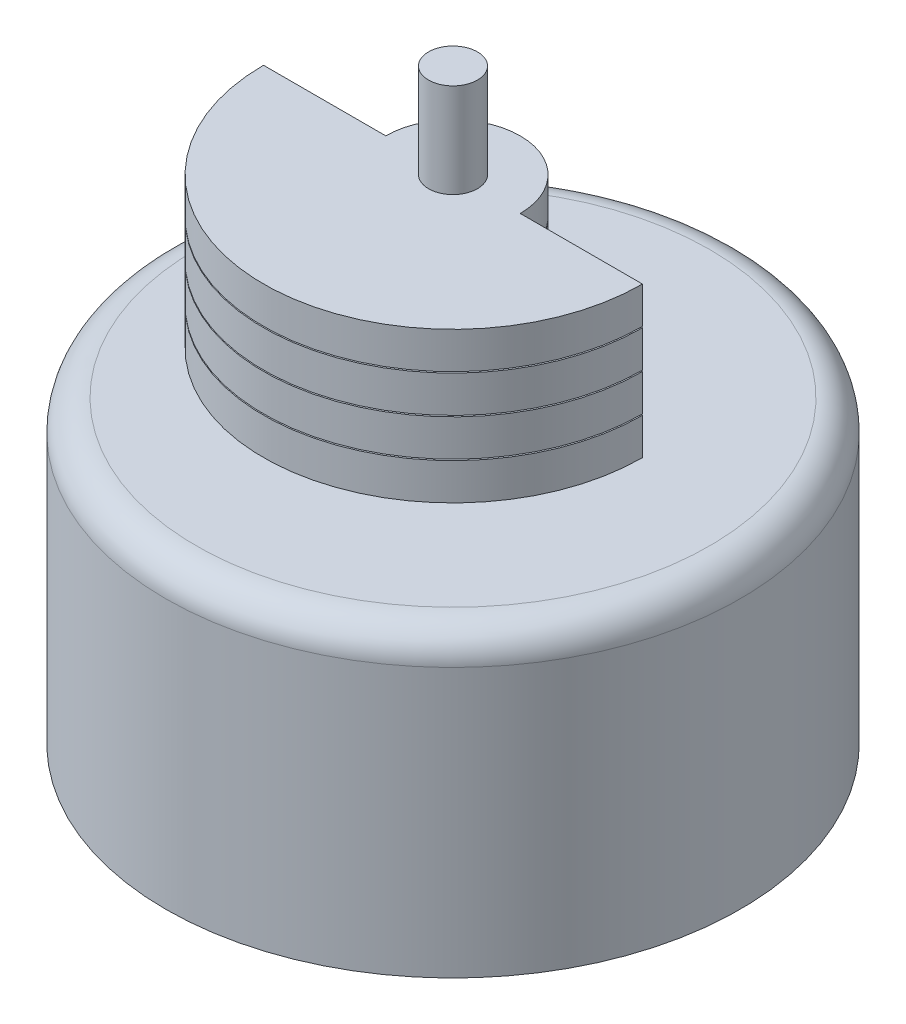
ISO-10303-21;
HEADER;
FILE_DESCRIPTION(('STEP AP214'),'2;1');
FILE_NAME('part.step','',(''),(''),'','','');
FILE_SCHEMA(('AUTOMOTIVE_DESIGN { 1 0 10303 214 1 1 1 1 }'));
ENDSEC;
DATA;
#1=APPLICATION_CONTEXT('core data for automotive mechanical design processes');
#2=APPLICATION_PROTOCOL_DEFINITION('international standard','automotive_design',2000,#1);
#3=PRODUCT_CONTEXT('',#1,'mechanical');
#4=PRODUCT('Part','Part','',(#3));
#5=PRODUCT_RELATED_PRODUCT_CATEGORY('part','',(#4));
#6=PRODUCT_DEFINITION_FORMATION('','',#4);
#7=PRODUCT_DEFINITION_CONTEXT('part definition',#1,'design');
#8=PRODUCT_DEFINITION('design','',#6,#7);
#9=PRODUCT_DEFINITION_SHAPE('','',#8);
#10=(LENGTH_UNIT() NAMED_UNIT(*) SI_UNIT(.MILLI.,.METRE.));
#11=(NAMED_UNIT(*) PLANE_ANGLE_UNIT() SI_UNIT($,.RADIAN.));
#12=(NAMED_UNIT(*) SI_UNIT($,.STERADIAN.) SOLID_ANGLE_UNIT());
#13=UNCERTAINTY_MEASURE_WITH_UNIT(LENGTH_MEASURE(1.E-05),#10,'distance_accuracy_value','');
#14=(GEOMETRIC_REPRESENTATION_CONTEXT(3) GLOBAL_UNCERTAINTY_ASSIGNED_CONTEXT((#13)) GLOBAL_UNIT_ASSIGNED_CONTEXT((#10,
#11,#12)) REPRESENTATION_CONTEXT('',''));
#15=CARTESIAN_POINT('',(0.,0.,0.));
#16=DIRECTION('',(0.,0.,1.));
#17=DIRECTION('',(1.,0.,0.));
#18=AXIS2_PLACEMENT_3D('',#15,#16,#17);
#19=CARTESIAN_POINT('',(0.,0.,0.));
#20=DIRECTION('',(0.,1.,0.));
#21=DIRECTION('',(0.,0.,1.));
#22=AXIS2_PLACEMENT_3D('',#19,#20,#21);
#23=CYLINDRICAL_SURFACE('',#22,1.016);
#24=CARTESIAN_POINT('',(0.,18.8976,0.));
#25=DIRECTION('',(0.,1.,0.));
#26=DIRECTION('',(0.,0.,1.));
#27=AXIS2_PLACEMENT_3D('',#24,#25,#26);
#28=CIRCLE('',#27,1.016);
#29=CARTESIAN_POINT('',(0.,18.8976,1.016));
#30=VERTEX_POINT('',#29);
#31=EDGE_CURVE('E255',#30,#30,#28,.T.);
#32=ORIENTED_EDGE('',*,*,#31,.T.);
#33=EDGE_LOOP('',(#32));
#34=FACE_BOUND('',#33,.T.);
#35=CARTESIAN_POINT('',(0.,18.9484,0.));
#36=DIRECTION('',(0.,1.,0.));
#37=DIRECTION('',(0.,0.,1.));
#38=AXIS2_PLACEMENT_3D('',#35,#36,#37);
#39=CIRCLE('',#38,1.016);
#40=CARTESIAN_POINT('',(0.,18.9484,1.016));
#41=VERTEX_POINT('',#40);
#42=EDGE_CURVE('E11',#41,#41,#39,.T.);
#43=ORIENTED_EDGE('',*,*,#42,.F.);
#44=EDGE_LOOP('',(#43));
#45=FACE_BOUND('',#44,.T.);
#46=ADVANCED_FACE('F51',(#34,#45),#23,.T.);
#47=CARTESIAN_POINT('',(0.,17.3228,0.));
#48=DIRECTION('',(0.,1.,0.));
#49=DIRECTION('',(0.,0.,1.));
#50=AXIS2_PLACEMENT_3D('',#47,#48,#49);
#51=CIRCLE('',#50,1.016);
#52=CARTESIAN_POINT('',(0.,17.3228,1.016));
#53=VERTEX_POINT('',#52);
#54=EDGE_CURVE('E298',#53,#53,#51,.T.);
#55=ORIENTED_EDGE('',*,*,#54,.T.);
#56=EDGE_LOOP('',(#55));
#57=FACE_BOUND('',#56,.T.);
#58=CARTESIAN_POINT('',(0.,17.3736,0.));
#59=DIRECTION('',(0.,1.,0.));
#60=DIRECTION('',(0.,0.,1.));
#61=AXIS2_PLACEMENT_3D('',#58,#59,#60);
#62=CIRCLE('',#61,1.016);
#63=CARTESIAN_POINT('',(0.,17.3736,1.016));
#64=VERTEX_POINT('',#63);
#65=EDGE_CURVE('E62',#64,#64,#62,.T.);
#66=ORIENTED_EDGE('',*,*,#65,.F.);
#67=EDGE_LOOP('',(#66));
#68=FACE_BOUND('',#67,.T.);
#69=ADVANCED_FACE('F429',(#57,#68),#23,.T.);
#70=CARTESIAN_POINT('',(0.,15.748,0.));
#71=DIRECTION('',(0.,1.,0.));
#72=DIRECTION('',(0.,0.,1.));
#73=AXIS2_PLACEMENT_3D('',#70,#71,#72);
#74=CIRCLE('',#73,1.016);
#75=CARTESIAN_POINT('',(0.,15.748,1.016));
#76=VERTEX_POINT('',#75);
#77=EDGE_CURVE('E332',#76,#76,#74,.T.);
#78=ORIENTED_EDGE('',*,*,#77,.T.);
#79=EDGE_LOOP('',(#78));
#80=FACE_BOUND('',#79,.T.);
#81=CARTESIAN_POINT('',(0.,15.7988,0.));
#82=DIRECTION('',(0.,1.,0.));
#83=DIRECTION('',(0.,0.,1.));
#84=AXIS2_PLACEMENT_3D('',#81,#82,#83);
#85=CIRCLE('',#84,1.016);
#86=CARTESIAN_POINT('',(0.,15.7988,1.016));
#87=VERTEX_POINT('',#86);
#88=EDGE_CURVE('E377',#87,#87,#85,.T.);
#89=ORIENTED_EDGE('',*,*,#88,.F.);
#90=EDGE_LOOP('',(#89));
#91=FACE_BOUND('',#90,.T.);
#92=ADVANCED_FACE('F435',(#80,#91),#23,.T.);
#93=CARTESIAN_POINT('',(0.,13.462,0.));
#94=DIRECTION('',(0.,1.,0.));
#95=DIRECTION('',(0.,0.,1.));
#96=AXIS2_PLACEMENT_3D('',#93,#94,#95);
#97=CIRCLE('',#96,1.016);
#98=CARTESIAN_POINT('',(0.,13.462,1.016));
#99=VERTEX_POINT('',#98);
#100=EDGE_CURVE('E333',#99,#99,#97,.T.);
#101=ORIENTED_EDGE('',*,*,#100,.T.);
#102=EDGE_LOOP('',(#101));
#103=FACE_BOUND('',#102,.T.);
#104=CARTESIAN_POINT('',(0.,14.224,0.));
#105=DIRECTION('',(0.,1.,0.));
#106=DIRECTION('',(0.,0.,1.));
#107=AXIS2_PLACEMENT_3D('',#104,#105,#106);
#108=CIRCLE('',#107,1.016);
#109=CARTESIAN_POINT('',(0.,14.224,1.016));
#110=VERTEX_POINT('',#109);
#111=EDGE_CURVE('E373',#110,#110,#108,.T.);
#112=ORIENTED_EDGE('',*,*,#111,.F.);
#113=EDGE_LOOP('',(#112));
#114=FACE_BOUND('',#113,.T.);
#115=ADVANCED_FACE('F442',(#103,#114),#23,.T.);
#116=CARTESIAN_POINT('',(0.,13.462,0.));
#117=DIRECTION('',(0.,-1.,0.));
#118=DIRECTION('',(0.,0.,-1.));
#119=AXIS2_PLACEMENT_3D('',#116,#117,#118);
#120=PLANE('',#119);
#121=ORIENTED_EDGE('',*,*,#100,.F.);
#122=EDGE_LOOP('',(#121));
#123=FACE_BOUND('',#122,.T.);
#124=CARTESIAN_POINT('',(0.,13.462,0.));
#125=DIRECTION('',(0.,1.,0.));
#126=DIRECTION('',(0.,0.,1.));
#127=AXIS2_PLACEMENT_3D('',#124,#125,#126);
#128=CIRCLE('',#127,3.302);
#129=CARTESIAN_POINT('',(0.,13.462,3.302));
#130=VERTEX_POINT('',#129);
#131=EDGE_CURVE('E353',#130,#130,#128,.T.);
#132=ORIENTED_EDGE('',*,*,#131,.T.);
#133=EDGE_LOOP('',(#132));
#134=FACE_BOUND('',#133,.T.);
#135=ADVANCED_FACE('F450',(#123,#134),#120,.F.);
#136=CARTESIAN_POINT('',(0.,0.,0.));
#137=DIRECTION('',(0.,1.,0.));
#138=DIRECTION('',(0.,0.,1.));
#139=AXIS2_PLACEMENT_3D('',#136,#137,#138);
#140=CYLINDRICAL_SURFACE('',#139,3.302);
#141=ORIENTED_EDGE('',*,*,#131,.F.);
#142=EDGE_LOOP('',(#141));
#143=FACE_BOUND('',#142,.T.);
#144=CARTESIAN_POINT('',(0.,12.446,0.));
#145=DIRECTION('',(0.,1.,0.));
#146=DIRECTION('',(0.,0.,1.));
#147=AXIS2_PLACEMENT_3D('',#144,#145,#146);
#148=CIRCLE('',#147,3.302);
#149=CARTESIAN_POINT('',(0.,12.446,3.302));
#150=VERTEX_POINT('',#149);
#151=EDGE_CURVE('E349',#150,#150,#148,.T.);
#152=ORIENTED_EDGE('',*,*,#151,.T.);
#153=EDGE_LOOP('',(#152));
#154=FACE_BOUND('',#153,.T.);
#155=ADVANCED_FACE('F456',(#143,#154),#140,.T.);
#156=CARTESIAN_POINT('',(0.,12.446,0.));
#157=DIRECTION('',(0.,-1.,0.));
#158=DIRECTION('',(0.,0.,-1.));
#159=AXIS2_PLACEMENT_3D('',#156,#157,#158);
#160=PLANE('',#159);
#161=CARTESIAN_POINT('',(0.,12.446,0.));
#162=DIRECTION('',(0.,-1.,0.));
#163=DIRECTION('',(0.,0.,-1.));
#164=AXIS2_PLACEMENT_3D('',#161,#162,#163);
#165=CIRCLE('',#164,10.668);
#166=CARTESIAN_POINT('',(0.,12.446,-10.668));
#167=VERTEX_POINT('',#166);
#168=EDGE_CURVE('E365',#167,#167,#165,.F.);
#169=ORIENTED_EDGE('',*,*,#168,.T.);
#170=EDGE_LOOP('',(#169));
#171=FACE_BOUND('',#170,.T.);
#172=ORIENTED_EDGE('',*,*,#151,.F.);
#173=EDGE_LOOP('',(#172));
#174=FACE_BOUND('',#173,.T.);
#175=ADVANCED_FACE('F659',(#171,#174),#160,.F.);
#176=CARTESIAN_POINT('',(0.,0.,0.));
#177=DIRECTION('',(0.,1.,0.));
#178=DIRECTION('',(0.,0.,1.));
#179=AXIS2_PLACEMENT_3D('',#176,#177,#178);
#180=CYLINDRICAL_SURFACE('',#179,11.938);
#181=CARTESIAN_POINT('',(0.,11.176,0.));
#182=DIRECTION('',(0.,-1.,0.));
#183=DIRECTION('',(0.,0.,-1.));
#184=AXIS2_PLACEMENT_3D('',#181,#182,#183);
#185=CIRCLE('',#184,11.938);
#186=CARTESIAN_POINT('',(0.,11.176,-11.938));
#187=VERTEX_POINT('',#186);
#188=EDGE_CURVE('E369',#187,#187,#185,.T.);
#189=ORIENTED_EDGE('',*,*,#188,.T.);
#190=EDGE_LOOP('',(#189));
#191=FACE_BOUND('',#190,.T.);
#192=CARTESIAN_POINT('',(0.,0.,0.));
#193=DIRECTION('',(0.,1.,0.));
#194=DIRECTION('',(0.,0.,1.));
#195=AXIS2_PLACEMENT_3D('',#192,#193,#194);
#196=CIRCLE('',#195,11.938);
#197=CARTESIAN_POINT('',(0.,0.,11.938));
#198=VERTEX_POINT('',#197);
#199=EDGE_CURVE('E345',#198,#198,#196,.T.);
#200=ORIENTED_EDGE('',*,*,#199,.T.);
#201=EDGE_LOOP('',(#200));
#202=FACE_BOUND('',#201,.T.);
#203=ADVANCED_FACE('F649',(#191,#202),#180,.T.);
#204=CARTESIAN_POINT('',(0.,0.,0.));
#205=DIRECTION('',(0.,1.,0.));
#206=DIRECTION('',(0.,0.,1.));
#207=AXIS2_PLACEMENT_3D('',#204,#205,#206);
#208=PLANE('',#207);
#209=ORIENTED_EDGE('',*,*,#199,.F.);
#210=EDGE_LOOP('',(#209));
#211=FACE_BOUND('',#210,.T.);
#212=CARTESIAN_POINT('',(0.,0.,0.));
#213=DIRECTION('',(0.,1.,0.));
#214=DIRECTION('',(0.,0.,1.));
#215=AXIS2_PLACEMENT_3D('',#212,#213,#214);
#216=CIRCLE('',#215,3.048);
#217=CARTESIAN_POINT('',(0.,0.,3.048));
#218=VERTEX_POINT('',#217);
#219=EDGE_CURVE('E341',#218,#218,#216,.T.);
#220=ORIENTED_EDGE('',*,*,#219,.T.);
#221=EDGE_LOOP('',(#220));
#222=FACE_BOUND('',#221,.T.);
#223=ADVANCED_FACE('F639',(#211,#222),#208,.F.);
#224=CARTESIAN_POINT('',(0.,0.,0.));
#225=DIRECTION('',(0.,1.,0.));
#226=DIRECTION('',(0.,0.,1.));
#227=AXIS2_PLACEMENT_3D('',#224,#225,#226);
#228=CYLINDRICAL_SURFACE('',#227,3.048);
#229=CARTESIAN_POINT('',(0.,-0.254,0.));
#230=DIRECTION('',(0.,1.,0.));
#231=DIRECTION('',(0.,0.,1.));
#232=AXIS2_PLACEMENT_3D('',#229,#230,#231);
#233=CIRCLE('',#232,3.048);
#234=CARTESIAN_POINT('',(0.,-0.254,3.048));
#235=VERTEX_POINT('',#234);
#236=EDGE_CURVE('E357',#235,#235,#233,.T.);
#237=ORIENTED_EDGE('',*,*,#236,.T.);
#238=EDGE_LOOP('',(#237));
#239=FACE_BOUND('',#238,.T.);
#240=ORIENTED_EDGE('',*,*,#219,.F.);
#241=EDGE_LOOP('',(#240));
#242=FACE_BOUND('',#241,.T.);
#243=ADVANCED_FACE('F629',(#239,#242),#228,.T.);
#244=CARTESIAN_POINT('',(0.,-1.524,0.));
#245=DIRECTION('',(0.,1.,0.));
#246=DIRECTION('',(0.,0.,1.));
#247=AXIS2_PLACEMENT_3D('',#244,#245,#246);
#248=PLANE('',#247);
#249=CARTESIAN_POINT('',(0.,-1.524,0.));
#250=DIRECTION('',(0.,1.,0.));
#251=DIRECTION('',(0.,0.,1.));
#252=AXIS2_PLACEMENT_3D('',#249,#250,#251);
#253=CIRCLE('',#252,1.778);
#254=CARTESIAN_POINT('',(0.,-1.524,1.778));
#255=VERTEX_POINT('',#254);
#256=EDGE_CURVE('E361',#255,#255,#253,.F.);
#257=ORIENTED_EDGE('',*,*,#256,.T.);
#258=EDGE_LOOP('',(#257));
#259=FACE_BOUND('',#258,.T.);
#260=ADVANCED_FACE('F621',(#259),#248,.F.);
#261=CARTESIAN_POINT('',(0.,-0.254,0.));
#262=DIRECTION('',(0.,1.,0.));
#263=DIRECTION('',(0.,0.,1.));
#264=AXIS2_PLACEMENT_3D('',#261,#262,#263);
#265=TOROIDAL_SURFACE('',#264,1.778,1.27);
#266=ORIENTED_EDGE('',*,*,#256,.F.);
#267=EDGE_LOOP('',(#266));
#268=FACE_BOUND('',#267,.T.);
#269=ORIENTED_EDGE('',*,*,#236,.F.);
#270=EDGE_LOOP('',(#269));
#271=FACE_BOUND('',#270,.T.);
#272=ADVANCED_FACE('F611',(#268,#271),#265,.T.);
#273=CARTESIAN_POINT('',(0.,11.176,0.));
#274=DIRECTION('',(0.,-1.,0.));
#275=DIRECTION('',(0.,0.,-1.));
#276=AXIS2_PLACEMENT_3D('',#273,#274,#275);
#277=TOROIDAL_SURFACE('',#276,10.668,1.27);
#278=ORIENTED_EDGE('',*,*,#188,.F.);
#279=EDGE_LOOP('',(#278));
#280=FACE_BOUND('',#279,.T.);
#281=ORIENTED_EDGE('',*,*,#168,.F.);
#282=EDGE_LOOP('',(#281));
#283=FACE_BOUND('',#282,.T.);
#284=ADVANCED_FACE('F53',(#280,#283),#277,.T.);
#285=CARTESIAN_POINT('',(0.,15.748,0.));
#286=DIRECTION('',(0.,-1.,0.));
#287=DIRECTION('',(0.,0.,-1.));
#288=AXIS2_PLACEMENT_3D('',#285,#286,#287);
#289=CYLINDRICAL_SURFACE('',#288,7.874);
#290=CARTESIAN_POINT('',(0.,14.224,0.));
#291=DIRECTION('',(0.,1.,0.));
#292=DIRECTION('',(0.,0.,1.));
#293=AXIS2_PLACEMENT_3D('',#290,#291,#292);
#294=CIRCLE('',#293,7.874);
#295=CARTESIAN_POINT('',(-7.874,14.224,0.));
#296=VERTEX_POINT('',#295);
#297=CARTESIAN_POINT('',(7.874,14.224,0.));
#298=VERTEX_POINT('',#297);
#299=EDGE_CURVE('E310',#296,#298,#294,.T.);
#300=ORIENTED_EDGE('',*,*,#299,.T.);
#301=DIRECTION('',(0.,-1.,0.));
#302=VECTOR('',#301,1.);
#303=CARTESIAN_POINT('',(7.874,15.748,0.));
#304=LINE('',#303,#302);
#305=CARTESIAN_POINT('',(7.874,15.748,0.));
#306=VERTEX_POINT('',#305);
#307=EDGE_CURVE('E329',#306,#298,#304,.T.);
#308=ORIENTED_EDGE('',*,*,#307,.F.);
#309=CARTESIAN_POINT('',(0.,15.748,0.));
#310=DIRECTION('',(0.,1.,0.));
#311=DIRECTION('',(0.,0.,1.));
#312=AXIS2_PLACEMENT_3D('',#309,#310,#311);
#313=CIRCLE('',#312,7.874);
#314=CARTESIAN_POINT('',(-7.874,15.748,0.));
#315=VERTEX_POINT('',#314);
#316=EDGE_CURVE('E299',#315,#306,#313,.T.);
#317=ORIENTED_EDGE('',*,*,#316,.F.);
#318=DIRECTION('',(0.,-1.,0.));
#319=VECTOR('',#318,1.);
#320=CARTESIAN_POINT('',(-7.874,15.748,0.));
#321=LINE('',#320,#319);
#322=EDGE_CURVE('E309',#315,#296,#321,.T.);
#323=ORIENTED_EDGE('',*,*,#322,.T.);
#324=EDGE_LOOP('',(#300,#308,#317,#323));
#325=FACE_BOUND('',#324,.T.);
#326=ADVANCED_FACE('F473',(#325),#289,.T.);
#327=CARTESIAN_POINT('',(2.794,15.748,0.));
#328=DIRECTION('',(0.,0.,1.));
#329=DIRECTION('',(1.,0.,0.));
#330=AXIS2_PLACEMENT_3D('',#327,#328,#329);
#331=PLANE('',#330);
#332=DIRECTION('',(-1.,0.,0.));
#333=VECTOR('',#332,1.);
#334=CARTESIAN_POINT('',(2.794,14.224,0.));
#335=LINE('',#334,#333);
#336=CARTESIAN_POINT('',(2.794,14.224,0.));
#337=VERTEX_POINT('',#336);
#338=EDGE_CURVE('E314',#298,#337,#335,.T.);
#339=ORIENTED_EDGE('',*,*,#338,.T.);
#340=DIRECTION('',(0.,-1.,0.));
#341=VECTOR('',#340,1.);
#342=CARTESIAN_POINT('',(2.794,15.748,0.));
#343=LINE('',#342,#341);
#344=CARTESIAN_POINT('',(2.794,15.748,0.));
#345=VERTEX_POINT('',#344);
#346=EDGE_CURVE('E326',#345,#337,#343,.T.);
#347=ORIENTED_EDGE('',*,*,#346,.F.);
#348=DIRECTION('',(-1.,0.,0.));
#349=VECTOR('',#348,1.);
#350=CARTESIAN_POINT('',(2.794,15.748,0.));
#351=LINE('',#350,#349);
#352=EDGE_CURVE('E102',#306,#345,#351,.T.);
#353=ORIENTED_EDGE('',*,*,#352,.F.);
#354=ORIENTED_EDGE('',*,*,#307,.T.);
#355=EDGE_LOOP('',(#339,#347,#353,#354));
#356=FACE_BOUND('',#355,.T.);
#357=ADVANCED_FACE('F478',(#356),#331,.F.);
#358=CARTESIAN_POINT('',(0.,15.748,0.));
#359=DIRECTION('',(0.,-1.,0.));
#360=DIRECTION('',(0.,0.,-1.));
#361=AXIS2_PLACEMENT_3D('',#358,#359,#360);
#362=CYLINDRICAL_SURFACE('',#361,2.794);
#363=CARTESIAN_POINT('',(0.,14.224,0.));
#364=DIRECTION('',(0.,1.,0.));
#365=DIRECTION('',(0.,0.,1.));
#366=AXIS2_PLACEMENT_3D('',#363,#364,#365);
#367=CIRCLE('',#366,2.794);
#368=CARTESIAN_POINT('',(-2.794,14.224,0.));
#369=VERTEX_POINT('',#368);
#370=EDGE_CURVE('E88',#337,#369,#367,.T.);
#371=ORIENTED_EDGE('',*,*,#370,.T.);
#372=DIRECTION('',(0.,-1.,0.));
#373=VECTOR('',#372,1.);
#374=CARTESIAN_POINT('',(-2.794,15.748,0.));
#375=LINE('',#374,#373);
#376=CARTESIAN_POINT('',(-2.794,15.748,0.));
#377=VERTEX_POINT('',#376);
#378=EDGE_CURVE('E323',#377,#369,#375,.T.);
#379=ORIENTED_EDGE('',*,*,#378,.F.);
#380=CARTESIAN_POINT('',(0.,15.748,0.));
#381=DIRECTION('',(0.,1.,0.));
#382=DIRECTION('',(0.,0.,1.));
#383=AXIS2_PLACEMENT_3D('',#380,#381,#382);
#384=CIRCLE('',#383,2.794);
#385=EDGE_CURVE('E304',#345,#377,#384,.T.);
#386=ORIENTED_EDGE('',*,*,#385,.F.);
#387=ORIENTED_EDGE('',*,*,#346,.T.);
#388=EDGE_LOOP('',(#371,#379,#386,#387));
#389=FACE_BOUND('',#388,.T.);
#390=ADVANCED_FACE('F477',(#389),#362,.T.);
#391=CARTESIAN_POINT('',(-7.874,15.748,0.));
#392=DIRECTION('',(0.,0.,1.));
#393=DIRECTION('',(1.,0.,0.));
#394=AXIS2_PLACEMENT_3D('',#391,#392,#393);
#395=PLANE('',#394);
#396=DIRECTION('',(-1.,0.,0.));
#397=VECTOR('',#396,1.);
#398=CARTESIAN_POINT('',(-7.874,14.224,0.));
#399=LINE('',#398,#397);
#400=EDGE_CURVE('E94',#369,#296,#399,.T.);
#401=ORIENTED_EDGE('',*,*,#400,.T.);
#402=ORIENTED_EDGE('',*,*,#322,.F.);
#403=DIRECTION('',(-1.,0.,0.));
#404=VECTOR('',#403,1.);
#405=CARTESIAN_POINT('',(-7.874,15.748,0.));
#406=LINE('',#405,#404);
#407=EDGE_CURVE('E70',#377,#315,#406,.T.);
#408=ORIENTED_EDGE('',*,*,#407,.F.);
#409=ORIENTED_EDGE('',*,*,#378,.T.);
#410=EDGE_LOOP('',(#401,#402,#408,#409));
#411=FACE_BOUND('',#410,.T.);
#412=ADVANCED_FACE('F475',(#411),#395,.F.);
#413=CARTESIAN_POINT('',(0.,15.748,0.));
#414=DIRECTION('',(0.,1.,0.));
#415=DIRECTION('',(0.,0.,1.));
#416=AXIS2_PLACEMENT_3D('',#413,#414,#415);
#417=PLANE('',#416);
#418=ORIENTED_EDGE('',*,*,#77,.F.);
#419=EDGE_LOOP('',(#418));
#420=FACE_BOUND('',#419,.T.);
#421=ORIENTED_EDGE('',*,*,#316,.T.);
#422=ORIENTED_EDGE('',*,*,#352,.T.);
#423=ORIENTED_EDGE('',*,*,#385,.T.);
#424=ORIENTED_EDGE('',*,*,#407,.T.);
#425=EDGE_LOOP('',(#421,#422,#423,#424));
#426=FACE_BOUND('',#425,.T.);
#427=ADVANCED_FACE('F468',(#420,#426),#417,.T.);
#428=CARTESIAN_POINT('',(0.,14.224,0.));
#429=DIRECTION('',(0.,1.,0.));
#430=DIRECTION('',(0.,0.,1.));
#431=AXIS2_PLACEMENT_3D('',#428,#429,#430);
#432=PLANE('',#431);
#433=ORIENTED_EDGE('',*,*,#111,.T.);
#434=EDGE_LOOP('',(#433));
#435=FACE_BOUND('',#434,.T.);
#436=ORIENTED_EDGE('',*,*,#299,.F.);
#437=ORIENTED_EDGE('',*,*,#400,.F.);
#438=ORIENTED_EDGE('',*,*,#370,.F.);
#439=ORIENTED_EDGE('',*,*,#338,.F.);
#440=EDGE_LOOP('',(#436,#437,#438,#439));
#441=FACE_BOUND('',#440,.T.);
#442=ADVANCED_FACE('F464',(#435,#441),#432,.F.);
#443=CARTESIAN_POINT('',(0.,17.3228,0.));
#444=DIRECTION('',(0.,-1.,0.));
#445=DIRECTION('',(0.,0.,-1.));
#446=AXIS2_PLACEMENT_3D('',#443,#444,#445);
#447=CYLINDRICAL_SURFACE('',#446,7.874);
#448=CARTESIAN_POINT('',(0.,15.7988,0.));
#449=DIRECTION('',(0.,1.,0.));
#450=DIRECTION('',(0.,0.,1.));
#451=AXIS2_PLACEMENT_3D('',#448,#449,#450);
#452=CIRCLE('',#451,7.874);
#453=CARTESIAN_POINT('',(-7.874,15.7988,0.));
#454=VERTEX_POINT('',#453);
#455=CARTESIAN_POINT('',(7.874,15.7988,0.));
#456=VERTEX_POINT('',#455);
#457=EDGE_CURVE('E271',#454,#456,#452,.T.);
#458=ORIENTED_EDGE('',*,*,#457,.T.);
#459=DIRECTION('',(0.,-1.,0.));
#460=VECTOR('',#459,1.);
#461=CARTESIAN_POINT('',(7.874,17.3228,0.));
#462=LINE('',#461,#460);
#463=CARTESIAN_POINT('',(7.874,17.3228,0.));
#464=VERTEX_POINT('',#463);
#465=EDGE_CURVE('E294',#464,#456,#462,.T.);
#466=ORIENTED_EDGE('',*,*,#465,.F.);
#467=CARTESIAN_POINT('',(0.,17.3228,0.));
#468=DIRECTION('',(0.,1.,0.));
#469=DIRECTION('',(0.,0.,1.));
#470=AXIS2_PLACEMENT_3D('',#467,#468,#469);
#471=CIRCLE('',#470,7.874);
#472=CARTESIAN_POINT('',(-7.874,17.3228,0.));
#473=VERTEX_POINT('',#472);
#474=EDGE_CURVE('E256',#473,#464,#471,.T.);
#475=ORIENTED_EDGE('',*,*,#474,.F.);
#476=DIRECTION('',(0.,-1.,0.));
#477=VECTOR('',#476,1.);
#478=CARTESIAN_POINT('',(-7.874,17.3228,0.));
#479=LINE('',#478,#477);
#480=EDGE_CURVE('E270',#473,#454,#479,.T.);
#481=ORIENTED_EDGE('',*,*,#480,.T.);
#482=EDGE_LOOP('',(#458,#466,#475,#481));
#483=FACE_BOUND('',#482,.T.);
#484=ADVANCED_FACE('F467',(#483),#447,.T.);
#485=CARTESIAN_POINT('',(2.794,17.3228,0.));
#486=DIRECTION('',(0.,0.,1.));
#487=DIRECTION('',(1.,0.,0.));
#488=AXIS2_PLACEMENT_3D('',#485,#486,#487);
#489=PLANE('',#488);
#490=DIRECTION('',(-1.,0.,0.));
#491=VECTOR('',#490,1.);
#492=CARTESIAN_POINT('',(2.794,15.7988,0.));
#493=LINE('',#492,#491);
#494=CARTESIAN_POINT('',(2.794,15.7988,0.));
#495=VERTEX_POINT('',#494);
#496=EDGE_CURVE('E275',#456,#495,#493,.T.);
#497=ORIENTED_EDGE('',*,*,#496,.T.);
#498=DIRECTION('',(0.,-1.,0.));
#499=VECTOR('',#498,1.);
#500=CARTESIAN_POINT('',(2.794,17.3228,0.));
#501=LINE('',#500,#499);
#502=CARTESIAN_POINT('',(2.794,17.3228,0.));
#503=VERTEX_POINT('',#502);
#504=EDGE_CURVE('E290',#503,#495,#501,.T.);
#505=ORIENTED_EDGE('',*,*,#504,.F.);
#506=DIRECTION('',(-1.,0.,0.));
#507=VECTOR('',#506,1.);
#508=CARTESIAN_POINT('',(2.794,17.3228,0.));
#509=LINE('',#508,#507);
#510=EDGE_CURVE('E260',#464,#503,#509,.T.);
#511=ORIENTED_EDGE('',*,*,#510,.F.);
#512=ORIENTED_EDGE('',*,*,#465,.T.);
#513=EDGE_LOOP('',(#497,#505,#511,#512));
#514=FACE_BOUND('',#513,.T.);
#515=ADVANCED_FACE('F494',(#514),#489,.F.);
#516=CARTESIAN_POINT('',(0.,17.3228,0.));
#517=DIRECTION('',(0.,-1.,0.));
#518=DIRECTION('',(0.,0.,-1.));
#519=AXIS2_PLACEMENT_3D('',#516,#517,#518);
#520=CYLINDRICAL_SURFACE('',#519,2.794);
#521=CARTESIAN_POINT('',(0.,15.7988,0.));
#522=DIRECTION('',(0.,1.,0.));
#523=DIRECTION('',(0.,0.,1.));
#524=AXIS2_PLACEMENT_3D('',#521,#522,#523);
#525=CIRCLE('',#524,2.794);
#526=CARTESIAN_POINT('',(-2.794,15.7988,0.));
#527=VERTEX_POINT('',#526);
#528=EDGE_CURVE('E278',#495,#527,#525,.T.);
#529=ORIENTED_EDGE('',*,*,#528,.T.);
#530=DIRECTION('',(0.,-1.,0.));
#531=VECTOR('',#530,1.);
#532=CARTESIAN_POINT('',(-2.794,17.3228,0.));
#533=LINE('',#532,#531);
#534=CARTESIAN_POINT('',(-2.794,17.3228,0.));
#535=VERTEX_POINT('',#534);
#536=EDGE_CURVE('E286',#535,#527,#533,.T.);
#537=ORIENTED_EDGE('',*,*,#536,.F.);
#538=CARTESIAN_POINT('',(0.,17.3228,0.));
#539=DIRECTION('',(0.,1.,0.));
#540=DIRECTION('',(0.,0.,1.));
#541=AXIS2_PLACEMENT_3D('',#538,#539,#540);
#542=CIRCLE('',#541,2.794);
#543=EDGE_CURVE('E264',#503,#535,#542,.T.);
#544=ORIENTED_EDGE('',*,*,#543,.F.);
#545=ORIENTED_EDGE('',*,*,#504,.T.);
#546=EDGE_LOOP('',(#529,#537,#544,#545));
#547=FACE_BOUND('',#546,.T.);
#548=ADVANCED_FACE('F498',(#547),#520,.T.);
#549=CARTESIAN_POINT('',(-7.874,17.3228,0.));
#550=DIRECTION('',(0.,0.,1.));
#551=DIRECTION('',(1.,0.,0.));
#552=AXIS2_PLACEMENT_3D('',#549,#550,#551);
#553=PLANE('',#552);
#554=DIRECTION('',(-1.,0.,0.));
#555=VECTOR('',#554,1.);
#556=CARTESIAN_POINT('',(-7.874,15.7988,0.));
#557=LINE('',#556,#555);
#558=EDGE_CURVE('E261',#527,#454,#557,.T.);
#559=ORIENTED_EDGE('',*,*,#558,.T.);
#560=ORIENTED_EDGE('',*,*,#480,.F.);
#561=DIRECTION('',(-1.,0.,0.));
#562=VECTOR('',#561,1.);
#563=CARTESIAN_POINT('',(-7.874,17.3228,0.));
#564=LINE('',#563,#562);
#565=EDGE_CURVE('E267',#535,#473,#564,.T.);
#566=ORIENTED_EDGE('',*,*,#565,.F.);
#567=ORIENTED_EDGE('',*,*,#536,.T.);
#568=EDGE_LOOP('',(#559,#560,#566,#567));
#569=FACE_BOUND('',#568,.T.);
#570=ADVANCED_FACE('F502',(#569),#553,.F.);
#571=CARTESIAN_POINT('',(0.,17.3228,0.));
#572=DIRECTION('',(0.,1.,0.));
#573=DIRECTION('',(0.,0.,1.));
#574=AXIS2_PLACEMENT_3D('',#571,#572,#573);
#575=PLANE('',#574);
#576=ORIENTED_EDGE('',*,*,#54,.F.);
#577=EDGE_LOOP('',(#576));
#578=FACE_BOUND('',#577,.T.);
#579=ORIENTED_EDGE('',*,*,#474,.T.);
#580=ORIENTED_EDGE('',*,*,#510,.T.);
#581=ORIENTED_EDGE('',*,*,#543,.T.);
#582=ORIENTED_EDGE('',*,*,#565,.T.);
#583=EDGE_LOOP('',(#579,#580,#581,#582));
#584=FACE_BOUND('',#583,.T.);
#585=ADVANCED_FACE('F506',(#578,#584),#575,.T.);
#586=CARTESIAN_POINT('',(0.,15.7988,0.));
#587=DIRECTION('',(0.,1.,0.));
#588=DIRECTION('',(0.,0.,1.));
#589=AXIS2_PLACEMENT_3D('',#586,#587,#588);
#590=PLANE('',#589);
#591=ORIENTED_EDGE('',*,*,#88,.T.);
#592=EDGE_LOOP('',(#591));
#593=FACE_BOUND('',#592,.T.);
#594=ORIENTED_EDGE('',*,*,#457,.F.);
#595=ORIENTED_EDGE('',*,*,#558,.F.);
#596=ORIENTED_EDGE('',*,*,#528,.F.);
#597=ORIENTED_EDGE('',*,*,#496,.F.);
#598=EDGE_LOOP('',(#594,#595,#596,#597));
#599=FACE_BOUND('',#598,.T.);
#600=ADVANCED_FACE('F508',(#593,#599),#590,.F.);
#601=CARTESIAN_POINT('',(0.,18.8976,0.));
#602=DIRECTION('',(0.,-1.,0.));
#603=DIRECTION('',(0.,0.,-1.));
#604=AXIS2_PLACEMENT_3D('',#601,#602,#603);
#605=CYLINDRICAL_SURFACE('',#604,7.874);
#606=CARTESIAN_POINT('',(0.,17.3736,0.));
#607=DIRECTION('',(0.,1.,0.));
#608=DIRECTION('',(0.,0.,1.));
#609=AXIS2_PLACEMENT_3D('',#606,#607,#608);
#610=CIRCLE('',#609,7.874);
#611=CARTESIAN_POINT('',(-7.874,17.3736,0.));
#612=VERTEX_POINT('',#611);
#613=CARTESIAN_POINT('',(7.874,17.3736,0.));
#614=VERTEX_POINT('',#613);
#615=EDGE_CURVE('E209',#612,#614,#610,.T.);
#616=ORIENTED_EDGE('',*,*,#615,.T.);
#617=DIRECTION('',(0.,-1.,0.));
#618=VECTOR('',#617,1.);
#619=CARTESIAN_POINT('',(7.874,18.8976,0.));
#620=LINE('',#619,#618);
#621=CARTESIAN_POINT('',(7.874,18.8976,0.));
#622=VERTEX_POINT('',#621);
#623=EDGE_CURVE('E251',#622,#614,#620,.T.);
#624=ORIENTED_EDGE('',*,*,#623,.F.);
#625=CARTESIAN_POINT('',(0.,18.8976,0.));
#626=DIRECTION('',(0.,1.,0.));
#627=DIRECTION('',(0.,0.,1.));
#628=AXIS2_PLACEMENT_3D('',#625,#626,#627);
#629=CIRCLE('',#628,7.874);
#630=CARTESIAN_POINT('',(-7.874,18.8976,0.));
#631=VERTEX_POINT('',#630);
#632=EDGE_CURVE('E214',#631,#622,#629,.T.);
#633=ORIENTED_EDGE('',*,*,#632,.F.);
#634=DIRECTION('',(0.,-1.,0.));
#635=VECTOR('',#634,1.);
#636=CARTESIAN_POINT('',(-7.874,18.8976,0.));
#637=LINE('',#636,#635);
#638=EDGE_CURVE('E228',#631,#612,#637,.T.);
#639=ORIENTED_EDGE('',*,*,#638,.T.);
#640=EDGE_LOOP('',(#616,#624,#633,#639));
#641=FACE_BOUND('',#640,.T.);
#642=ADVANCED_FACE('F408',(#641),#605,.T.);
#643=CARTESIAN_POINT('',(2.794,18.8976,0.));
#644=DIRECTION('',(0.,0.,1.));
#645=DIRECTION('',(1.,0.,0.));
#646=AXIS2_PLACEMENT_3D('',#643,#644,#645);
#647=PLANE('',#646);
#648=DIRECTION('',(-1.,0.,0.));
#649=VECTOR('',#648,1.);
#650=CARTESIAN_POINT('',(2.794,17.3736,0.));
#651=LINE('',#650,#649);
#652=CARTESIAN_POINT('',(2.794,17.3736,0.));
#653=VERTEX_POINT('',#652);
#654=EDGE_CURVE('E232',#614,#653,#651,.T.);
#655=ORIENTED_EDGE('',*,*,#654,.T.);
#656=DIRECTION('',(0.,-1.,0.));
#657=VECTOR('',#656,1.);
#658=CARTESIAN_POINT('',(2.794,18.8976,0.));
#659=LINE('',#658,#657);
#660=CARTESIAN_POINT('',(2.794,18.8976,0.));
#661=VERTEX_POINT('',#660);
#662=EDGE_CURVE('E247',#661,#653,#659,.T.);
#663=ORIENTED_EDGE('',*,*,#662,.F.);
#664=DIRECTION('',(-1.,0.,0.));
#665=VECTOR('',#664,1.);
#666=CARTESIAN_POINT('',(2.794,18.8976,0.));
#667=LINE('',#666,#665);
#668=EDGE_CURVE('E218',#622,#661,#667,.T.);
#669=ORIENTED_EDGE('',*,*,#668,.F.);
#670=ORIENTED_EDGE('',*,*,#623,.T.);
#671=EDGE_LOOP('',(#655,#663,#669,#670));
#672=FACE_BOUND('',#671,.T.);
#673=ADVANCED_FACE('F411',(#672),#647,.F.);
#674=CARTESIAN_POINT('',(0.,18.8976,0.));
#675=DIRECTION('',(0.,-1.,0.));
#676=DIRECTION('',(0.,0.,-1.));
#677=AXIS2_PLACEMENT_3D('',#674,#675,#676);
#678=CYLINDRICAL_SURFACE('',#677,2.794);
#679=CARTESIAN_POINT('',(0.,17.3736,0.));
#680=DIRECTION('',(0.,1.,0.));
#681=DIRECTION('',(0.,0.,1.));
#682=AXIS2_PLACEMENT_3D('',#679,#680,#681);
#683=CIRCLE('',#682,2.794);
#684=CARTESIAN_POINT('',(-2.794,17.3736,0.));
#685=VERTEX_POINT('',#684);
#686=EDGE_CURVE('E235',#653,#685,#683,.T.);
#687=ORIENTED_EDGE('',*,*,#686,.T.);
#688=DIRECTION('',(0.,-1.,0.));
#689=VECTOR('',#688,1.);
#690=CARTESIAN_POINT('',(-2.794,18.8976,0.));
#691=LINE('',#690,#689);
#692=CARTESIAN_POINT('',(-2.794,18.8976,0.));
#693=VERTEX_POINT('',#692);
#694=EDGE_CURVE('E243',#693,#685,#691,.T.);
#695=ORIENTED_EDGE('',*,*,#694,.F.);
#696=CARTESIAN_POINT('',(0.,18.8976,0.));
#697=DIRECTION('',(0.,1.,0.));
#698=DIRECTION('',(0.,0.,1.));
#699=AXIS2_PLACEMENT_3D('',#696,#697,#698);
#700=CIRCLE('',#699,2.794);
#701=EDGE_CURVE('E222',#661,#693,#700,.T.);
#702=ORIENTED_EDGE('',*,*,#701,.F.);
#703=ORIENTED_EDGE('',*,*,#662,.T.);
#704=EDGE_LOOP('',(#687,#695,#702,#703));
#705=FACE_BOUND('',#704,.T.);
#706=ADVANCED_FACE('F416',(#705),#678,.T.);
#707=CARTESIAN_POINT('',(-7.874,18.8976,0.));
#708=DIRECTION('',(0.,0.,1.));
#709=DIRECTION('',(1.,0.,0.));
#710=AXIS2_PLACEMENT_3D('',#707,#708,#709);
#711=PLANE('',#710);
#712=DIRECTION('',(-1.,0.,0.));
#713=VECTOR('',#712,1.);
#714=CARTESIAN_POINT('',(-7.874,17.3736,0.));
#715=LINE('',#714,#713);
#716=EDGE_CURVE('E219',#685,#612,#715,.T.);
#717=ORIENTED_EDGE('',*,*,#716,.T.);
#718=ORIENTED_EDGE('',*,*,#638,.F.);
#719=DIRECTION('',(-1.,0.,0.));
#720=VECTOR('',#719,1.);
#721=CARTESIAN_POINT('',(-7.874,18.8976,0.));
#722=LINE('',#721,#720);
#723=EDGE_CURVE('E225',#693,#631,#722,.T.);
#724=ORIENTED_EDGE('',*,*,#723,.F.);
#725=ORIENTED_EDGE('',*,*,#694,.T.);
#726=EDGE_LOOP('',(#717,#718,#724,#725));
#727=FACE_BOUND('',#726,.T.);
#728=ADVANCED_FACE('F400',(#727),#711,.F.);
#729=CARTESIAN_POINT('',(0.,18.8976,0.));
#730=DIRECTION('',(0.,1.,0.));
#731=DIRECTION('',(0.,0.,1.));
#732=AXIS2_PLACEMENT_3D('',#729,#730,#731);
#733=PLANE('',#732);
#734=ORIENTED_EDGE('',*,*,#31,.F.);
#735=EDGE_LOOP('',(#734));
#736=FACE_BOUND('',#735,.T.);
#737=ORIENTED_EDGE('',*,*,#632,.T.);
#738=ORIENTED_EDGE('',*,*,#668,.T.);
#739=ORIENTED_EDGE('',*,*,#701,.T.);
#740=ORIENTED_EDGE('',*,*,#723,.T.);
#741=EDGE_LOOP('',(#737,#738,#739,#740));
#742=FACE_BOUND('',#741,.T.);
#743=ADVANCED_FACE('F396',(#736,#742),#733,.T.);
#744=CARTESIAN_POINT('',(0.,17.3736,0.));
#745=DIRECTION('',(0.,1.,0.));
#746=DIRECTION('',(0.,0.,1.));
#747=AXIS2_PLACEMENT_3D('',#744,#745,#746);
#748=PLANE('',#747);
#749=ORIENTED_EDGE('',*,*,#65,.T.);
#750=EDGE_LOOP('',(#749));
#751=FACE_BOUND('',#750,.T.);
#752=ORIENTED_EDGE('',*,*,#615,.F.);
#753=ORIENTED_EDGE('',*,*,#716,.F.);
#754=ORIENTED_EDGE('',*,*,#686,.F.);
#755=ORIENTED_EDGE('',*,*,#654,.F.);
#756=EDGE_LOOP('',(#752,#753,#754,#755));
#757=FACE_BOUND('',#756,.T.);
#758=ADVANCED_FACE('F399',(#751,#757),#748,.F.);
#759=CARTESIAN_POINT('',(0.,20.4724,0.));
#760=DIRECTION('',(0.,-1.,0.));
#761=DIRECTION('',(0.,0.,-1.));
#762=AXIS2_PLACEMENT_3D('',#759,#760,#761);
#763=CYLINDRICAL_SURFACE('',#762,7.874);
#764=CARTESIAN_POINT('',(0.,18.9484,0.));
#765=DIRECTION('',(0.,1.,0.));
#766=DIRECTION('',(0.,0.,1.));
#767=AXIS2_PLACEMENT_3D('',#764,#765,#766);
#768=CIRCLE('',#767,7.874);
#769=CARTESIAN_POINT('',(-7.874,18.9484,0.));
#770=VERTEX_POINT('',#769);
#771=CARTESIAN_POINT('',(7.874,18.9484,0.));
#772=VERTEX_POINT('',#771);
#773=EDGE_CURVE('E203',#770,#772,#768,.T.);
#774=ORIENTED_EDGE('',*,*,#773,.T.);
#775=DIRECTION('',(0.,-1.,0.));
#776=VECTOR('',#775,1.);
#777=CARTESIAN_POINT('',(7.874,20.4724,0.));
#778=LINE('',#777,#776);
#779=CARTESIAN_POINT('',(7.874,20.4724,0.));
#780=VERTEX_POINT('',#779);
#781=EDGE_CURVE('E181',#780,#772,#778,.T.);
#782=ORIENTED_EDGE('',*,*,#781,.F.);
#783=CARTESIAN_POINT('',(0.,20.4724,0.));
#784=DIRECTION('',(0.,1.,0.));
#785=DIRECTION('',(0.,0.,1.));
#786=AXIS2_PLACEMENT_3D('',#783,#784,#785);
#787=CIRCLE('',#786,7.874);
#788=CARTESIAN_POINT('',(-7.874,20.4724,0.));
#789=VERTEX_POINT('',#788);
#790=EDGE_CURVE('E189',#789,#780,#787,.T.);
#791=ORIENTED_EDGE('',*,*,#790,.F.);
#792=DIRECTION('',(0.,-1.,0.));
#793=VECTOR('',#792,1.);
#794=CARTESIAN_POINT('',(-7.874,20.4724,0.));
#795=LINE('',#794,#793);
#796=EDGE_CURVE('E888',#789,#770,#795,.T.);
#797=ORIENTED_EDGE('',*,*,#796,.T.);
#798=EDGE_LOOP('',(#774,#782,#791,#797));
#799=FACE_BOUND('',#798,.T.);
#800=ADVANCED_FACE('F201',(#799),#763,.T.);
#801=CARTESIAN_POINT('',(2.794,20.4724,0.));
#802=DIRECTION('',(0.,0.,1.));
#803=DIRECTION('',(1.,0.,0.));
#804=AXIS2_PLACEMENT_3D('',#801,#802,#803);
#805=PLANE('',#804);
#806=DIRECTION('',(-1.,0.,0.));
#807=VECTOR('',#806,1.);
#808=CARTESIAN_POINT('',(2.794,18.9484,0.));
#809=LINE('',#808,#807);
#810=CARTESIAN_POINT('',(2.794,18.9484,0.));
#811=VERTEX_POINT('',#810);
#812=EDGE_CURVE('E875',#772,#811,#809,.T.);
#813=ORIENTED_EDGE('',*,*,#812,.T.);
#814=DIRECTION('',(0.,-1.,0.));
#815=VECTOR('',#814,1.);
#816=CARTESIAN_POINT('',(2.794,20.4724,0.));
#817=LINE('',#816,#815);
#818=CARTESIAN_POINT('',(2.794,20.4724,0.));
#819=VERTEX_POINT('',#818);
#820=EDGE_CURVE('E184',#819,#811,#817,.T.);
#821=ORIENTED_EDGE('',*,*,#820,.F.);
#822=DIRECTION('',(-1.,0.,0.));
#823=VECTOR('',#822,1.);
#824=CARTESIAN_POINT('',(2.794,20.4724,0.));
#825=LINE('',#824,#823);
#826=EDGE_CURVE('E177',#780,#819,#825,.T.);
#827=ORIENTED_EDGE('',*,*,#826,.F.);
#828=ORIENTED_EDGE('',*,*,#781,.T.);
#829=EDGE_LOOP('',(#813,#821,#827,#828));
#830=FACE_BOUND('',#829,.T.);
#831=ADVANCED_FACE('F179',(#830),#805,.F.);
#832=CARTESIAN_POINT('',(0.,20.4724,0.));
#833=DIRECTION('',(0.,-1.,0.));
#834=DIRECTION('',(0.,0.,-1.));
#835=AXIS2_PLACEMENT_3D('',#832,#833,#834);
#836=CYLINDRICAL_SURFACE('',#835,2.794);
#837=CARTESIAN_POINT('',(0.,18.9484,0.));
#838=DIRECTION('',(0.,1.,0.));
#839=DIRECTION('',(0.,0.,1.));
#840=AXIS2_PLACEMENT_3D('',#837,#838,#839);
#841=CIRCLE('',#840,2.794);
#842=CARTESIAN_POINT('',(-2.794,18.9484,0.));
#843=VERTEX_POINT('',#842);
#844=EDGE_CURVE('E879',#811,#843,#841,.T.);
#845=ORIENTED_EDGE('',*,*,#844,.T.);
#846=DIRECTION('',(0.,-1.,0.));
#847=VECTOR('',#846,1.);
#848=CARTESIAN_POINT('',(-2.794,20.4724,0.));
#849=LINE('',#848,#847);
#850=CARTESIAN_POINT('',(-2.794,20.4724,0.));
#851=VERTEX_POINT('',#850);
#852=EDGE_CURVE('E210',#851,#843,#849,.T.);
#853=ORIENTED_EDGE('',*,*,#852,.F.);
#854=CARTESIAN_POINT('',(0.,20.4724,0.));
#855=DIRECTION('',(0.,1.,0.));
#856=DIRECTION('',(0.,0.,1.));
#857=AXIS2_PLACEMENT_3D('',#854,#855,#856);
#858=CIRCLE('',#857,2.794);
#859=EDGE_CURVE('E188',#819,#851,#858,.T.);
#860=ORIENTED_EDGE('',*,*,#859,.F.);
#861=ORIENTED_EDGE('',*,*,#820,.T.);
#862=EDGE_LOOP('',(#845,#853,#860,#861));
#863=FACE_BOUND('',#862,.T.);
#864=ADVANCED_FACE('F550',(#863),#836,.T.);
#865=CARTESIAN_POINT('',(-7.874,20.4724,0.));
#866=DIRECTION('',(0.,0.,1.));
#867=DIRECTION('',(1.,0.,0.));
#868=AXIS2_PLACEMENT_3D('',#865,#866,#867);
#869=PLANE('',#868);
#870=DIRECTION('',(-1.,0.,0.));
#871=VECTOR('',#870,1.);
#872=CARTESIAN_POINT('',(-7.874,18.9484,0.));
#873=LINE('',#872,#871);
#874=EDGE_CURVE('E199',#843,#770,#873,.T.);
#875=ORIENTED_EDGE('',*,*,#874,.T.);
#876=ORIENTED_EDGE('',*,*,#796,.F.);
#877=DIRECTION('',(-1.,0.,0.));
#878=VECTOR('',#877,1.);
#879=CARTESIAN_POINT('',(-7.874,20.4724,0.));
#880=LINE('',#879,#878);
#881=EDGE_CURVE('E194',#851,#789,#880,.T.);
#882=ORIENTED_EDGE('',*,*,#881,.F.);
#883=ORIENTED_EDGE('',*,*,#852,.T.);
#884=EDGE_LOOP('',(#875,#876,#882,#883));
#885=FACE_BOUND('',#884,.T.);
#886=ADVANCED_FACE('F559',(#885),#869,.F.);
#887=CARTESIAN_POINT('',(0.,20.4724,0.));
#888=DIRECTION('',(0.,1.,0.));
#889=DIRECTION('',(0.,0.,1.));
#890=AXIS2_PLACEMENT_3D('',#887,#888,#889);
#891=PLANE('',#890);
#892=CARTESIAN_POINT('',(0.,20.4724,0.));
#893=DIRECTION('',(0.,1.,0.));
#894=DIRECTION('',(0.,0.,1.));
#895=AXIS2_PLACEMENT_3D('',#892,#893,#894);
#896=CIRCLE('',#895,1.016);
#897=CARTESIAN_POINT('',(0.,20.4724,1.016));
#898=VERTEX_POINT('',#897);
#899=EDGE_CURVE('E55',#898,#898,#896,.T.);
#900=ORIENTED_EDGE('',*,*,#899,.F.);
#901=EDGE_LOOP('',(#900));
#902=FACE_BOUND('',#901,.T.);
#903=ORIENTED_EDGE('',*,*,#790,.T.);
#904=ORIENTED_EDGE('',*,*,#826,.T.);
#905=ORIENTED_EDGE('',*,*,#859,.T.);
#906=ORIENTED_EDGE('',*,*,#881,.T.);
#907=EDGE_LOOP('',(#903,#904,#905,#906));
#908=FACE_BOUND('',#907,.T.);
#909=ADVANCED_FACE('F192',(#902,#908),#891,.T.);
#910=CARTESIAN_POINT('',(0.,18.9484,0.));
#911=DIRECTION('',(0.,1.,0.));
#912=DIRECTION('',(0.,0.,1.));
#913=AXIS2_PLACEMENT_3D('',#910,#911,#912);
#914=PLANE('',#913);
#915=ORIENTED_EDGE('',*,*,#42,.T.);
#916=EDGE_LOOP('',(#915));
#917=FACE_BOUND('',#916,.T.);
#918=ORIENTED_EDGE('',*,*,#773,.F.);
#919=ORIENTED_EDGE('',*,*,#874,.F.);
#920=ORIENTED_EDGE('',*,*,#844,.F.);
#921=ORIENTED_EDGE('',*,*,#812,.F.);
#922=EDGE_LOOP('',(#918,#919,#920,#921));
#923=FACE_BOUND('',#922,.T.);
#924=ADVANCED_FACE('F446',(#917,#923),#914,.F.);
#925=CARTESIAN_POINT('',(0.,24.384,0.));
#926=DIRECTION('',(0.,-1.,0.));
#927=DIRECTION('',(0.,0.,-1.));
#928=AXIS2_PLACEMENT_3D('',#925,#926,#927);
#929=PLANE('',#928);
#930=CARTESIAN_POINT('',(0.,24.384,0.));
#931=DIRECTION('',(0.,1.,0.));
#932=DIRECTION('',(0.,0.,1.));
#933=AXIS2_PLACEMENT_3D('',#930,#931,#932);
#934=CIRCLE('',#933,1.016);
#935=CARTESIAN_POINT('',(0.,24.384,1.016));
#936=VERTEX_POINT('',#935);
#937=EDGE_CURVE('E337',#936,#936,#934,.T.);
#938=ORIENTED_EDGE('',*,*,#937,.T.);
#939=EDGE_LOOP('',(#938));
#940=FACE_BOUND('',#939,.T.);
#941=ADVANCED_FACE('F440',(#940),#929,.F.);
#942=ORIENTED_EDGE('',*,*,#899,.T.);
#943=EDGE_LOOP('',(#942));
#944=FACE_BOUND('',#943,.T.);
#945=ORIENTED_EDGE('',*,*,#937,.F.);
#946=EDGE_LOOP('',(#945));
#947=FACE_BOUND('',#946,.T.);
#948=ADVANCED_FACE('F431',(#944,#947),#23,.T.);
#949=CLOSED_SHELL('',(#46,#69,#92,#115,#135,#155,#175,#203,#223,#243,#260,#272,#284,#326,#357,
#390,#412,#427,#442,#484,#515,#548,#570,#585,#600,#642,#673,#706,#728,#743,#758,#800,#831,#864,
#886,#909,#924,#941,#948));
#950=MANIFOLD_SOLID_BREP('B2',#949);
#951=ADVANCED_BREP_SHAPE_REPRESENTATION('',(#18,#950),#14);
#952=SHAPE_DEFINITION_REPRESENTATION(#9,#951);
ENDSEC;
END-ISO-10303-21;
